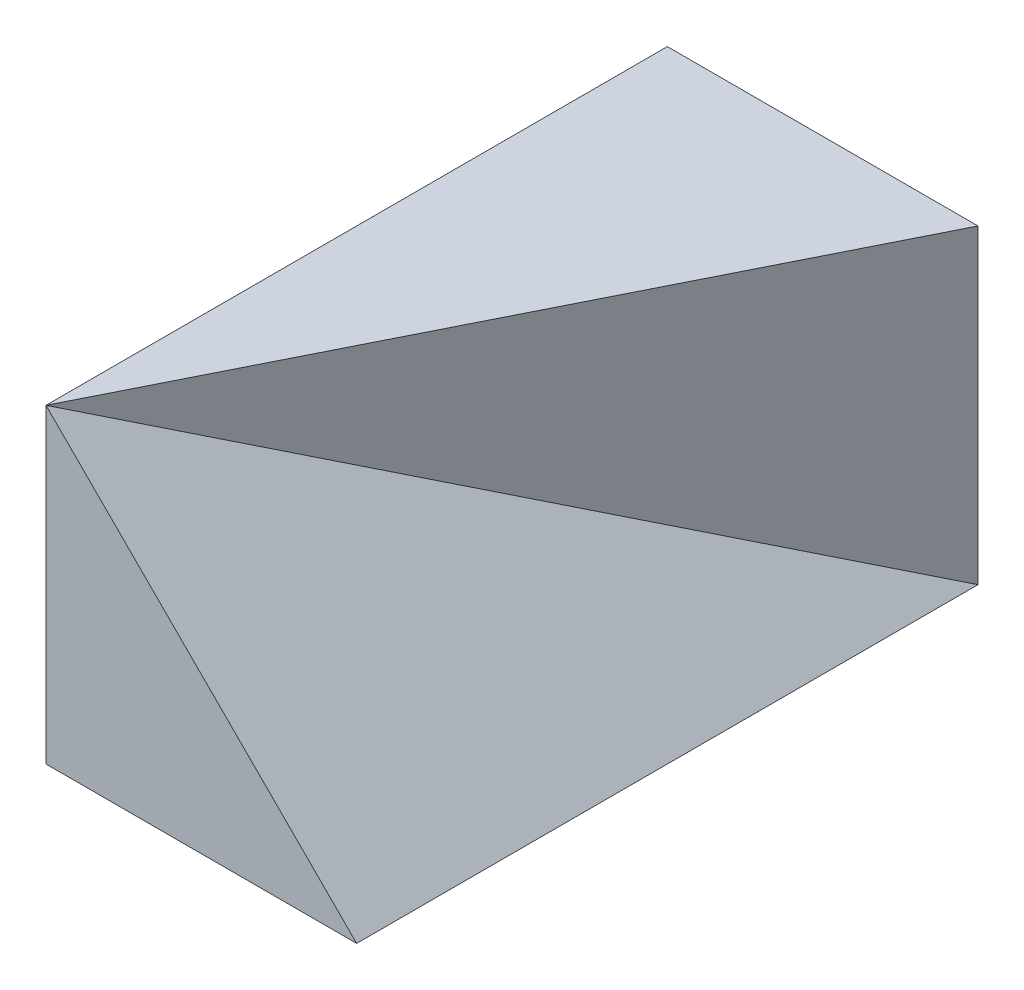
ISO-10303-21;
HEADER;
FILE_DESCRIPTION(('STEP AP214'),'2;1');
FILE_NAME('part.step','',(''),(''),'','','');
FILE_SCHEMA(('AUTOMOTIVE_DESIGN { 1 0 10303 214 1 1 1 1 }'));
ENDSEC;
DATA;
#1=APPLICATION_CONTEXT('core data for automotive mechanical design processes');
#2=APPLICATION_PROTOCOL_DEFINITION('international standard','automotive_design',2000,#1);
#3=PRODUCT_CONTEXT('',#1,'mechanical');
#4=PRODUCT('Part','Part','',(#3));
#5=PRODUCT_RELATED_PRODUCT_CATEGORY('part','',(#4));
#6=PRODUCT_DEFINITION_FORMATION('','',#4);
#7=PRODUCT_DEFINITION_CONTEXT('part definition',#1,'design');
#8=PRODUCT_DEFINITION('design','',#6,#7);
#9=PRODUCT_DEFINITION_SHAPE('','',#8);
#10=(LENGTH_UNIT() NAMED_UNIT(*) SI_UNIT(.MILLI.,.METRE.));
#11=(NAMED_UNIT(*) PLANE_ANGLE_UNIT() SI_UNIT($,.RADIAN.));
#12=(NAMED_UNIT(*) SI_UNIT($,.STERADIAN.) SOLID_ANGLE_UNIT());
#13=UNCERTAINTY_MEASURE_WITH_UNIT(LENGTH_MEASURE(1.E-05),#10,'distance_accuracy_value','');
#14=(GEOMETRIC_REPRESENTATION_CONTEXT(3) GLOBAL_UNCERTAINTY_ASSIGNED_CONTEXT((#13)) GLOBAL_UNIT_ASSIGNED_CONTEXT((#10,
#11,#12)) REPRESENTATION_CONTEXT('',''));
#15=CARTESIAN_POINT('',(0.,0.,0.));
#16=DIRECTION('',(0.,0.,1.));
#17=DIRECTION('',(1.,0.,0.));
#18=AXIS2_PLACEMENT_3D('',#15,#16,#17);
#19=CARTESIAN_POINT('',(-25.,25.,50.));
#20=DIRECTION('',(0.,-1.,0.));
#21=DIRECTION('',(0.,0.,-1.));
#22=AXIS2_PLACEMENT_3D('',#19,#20,#21);
#23=PLANE('',#22);
#24=DIRECTION('',(-0.447213595499958,0.,0.894427190999916));
#25=VECTOR('',#24,1.);
#26=CARTESIAN_POINT('',(-25.,25.,50.));
#27=LINE('',#26,#25);
#28=CARTESIAN_POINT('',(25.,25.,-50.));
#29=VERTEX_POINT('',#28);
#30=CARTESIAN_POINT('',(-25.,25.,50.));
#31=VERTEX_POINT('',#30);
#32=EDGE_CURVE('E139',#29,#31,#27,.T.);
#33=ORIENTED_EDGE('',*,*,#32,.F.);
#34=DIRECTION('',(-1.,0.,0.));
#35=VECTOR('',#34,1.);
#36=CARTESIAN_POINT('',(-25.,25.,-50.));
#37=LINE('',#36,#35);
#38=CARTESIAN_POINT('',(-25.,25.,-50.));
#39=VERTEX_POINT('',#38);
#40=EDGE_CURVE('E111',#29,#39,#37,.T.);
#41=ORIENTED_EDGE('',*,*,#40,.T.);
#42=DIRECTION('',(0.,0.,-1.));
#43=VECTOR('',#42,1.);
#44=CARTESIAN_POINT('',(-25.,25.,50.));
#45=LINE('',#44,#43);
#46=EDGE_CURVE('E12',#31,#39,#45,.T.);
#47=ORIENTED_EDGE('',*,*,#46,.F.);
#48=EDGE_LOOP('',(#33,#41,#47));
#49=FACE_BOUND('',#48,.T.);
#50=ADVANCED_FACE('F70',(#49),#23,.F.);
#51=CARTESIAN_POINT('',(-25.,-25.,50.));
#52=DIRECTION('',(1.,0.,0.));
#53=DIRECTION('',(0.,0.,-1.));
#54=AXIS2_PLACEMENT_3D('',#51,#52,#53);
#55=PLANE('',#54);
#56=DIRECTION('',(0.,-1.,0.));
#57=VECTOR('',#56,1.);
#58=CARTESIAN_POINT('',(-25.,-25.,-50.));
#59=LINE('',#58,#57);
#60=CARTESIAN_POINT('',(-25.,-25.,-50.));
#61=VERTEX_POINT('',#60);
#62=EDGE_CURVE('E101',#39,#61,#59,.T.);
#63=ORIENTED_EDGE('',*,*,#62,.T.);
#64=DIRECTION('',(0.,0.,-1.));
#65=VECTOR('',#64,1.);
#66=CARTESIAN_POINT('',(-25.,-25.,50.));
#67=LINE('',#66,#65);
#68=CARTESIAN_POINT('',(-25.,-25.,50.));
#69=VERTEX_POINT('',#68);
#70=EDGE_CURVE('E80',#69,#61,#67,.T.);
#71=ORIENTED_EDGE('',*,*,#70,.F.);
#72=DIRECTION('',(0.,-1.,0.));
#73=VECTOR('',#72,1.);
#74=CARTESIAN_POINT('',(-25.,-25.,50.));
#75=LINE('',#74,#73);
#76=EDGE_CURVE('E88',#31,#69,#75,.T.);
#77=ORIENTED_EDGE('',*,*,#76,.F.);
#78=ORIENTED_EDGE('',*,*,#46,.T.);
#79=EDGE_LOOP('',(#63,#71,#77,#78));
#80=FACE_BOUND('',#79,.T.);
#81=ADVANCED_FACE('F103',(#80),#55,.F.);
#82=CARTESIAN_POINT('',(-25.,-25.,50.));
#83=DIRECTION('',(0.,1.,0.));
#84=DIRECTION('',(0.,0.,1.));
#85=AXIS2_PLACEMENT_3D('',#82,#83,#84);
#86=PLANE('',#85);
#87=DIRECTION('',(1.,0.,0.));
#88=VECTOR('',#87,1.);
#89=CARTESIAN_POINT('',(-25.,-25.,-50.));
#90=LINE('',#89,#88);
#91=CARTESIAN_POINT('',(25.,-25.,-50.));
#92=VERTEX_POINT('',#91);
#93=EDGE_CURVE('E110',#61,#92,#90,.T.);
#94=ORIENTED_EDGE('',*,*,#93,.T.);
#95=DIRECTION('',(0.,0.,-1.));
#96=VECTOR('',#95,1.);
#97=CARTESIAN_POINT('',(25.,-25.,50.));
#98=LINE('',#97,#96);
#99=CARTESIAN_POINT('',(25.,-25.,50.));
#100=VERTEX_POINT('',#99);
#101=EDGE_CURVE('E120',#100,#92,#98,.T.);
#102=ORIENTED_EDGE('',*,*,#101,.F.);
#103=DIRECTION('',(1.,0.,0.));
#104=VECTOR('',#103,1.);
#105=CARTESIAN_POINT('',(-25.,-25.,50.));
#106=LINE('',#105,#104);
#107=EDGE_CURVE('E118',#69,#100,#106,.T.);
#108=ORIENTED_EDGE('',*,*,#107,.F.);
#109=ORIENTED_EDGE('',*,*,#70,.T.);
#110=EDGE_LOOP('',(#94,#102,#108,#109));
#111=FACE_BOUND('',#110,.T.);
#112=ADVANCED_FACE('F115',(#111),#86,.F.);
#113=CARTESIAN_POINT('',(0.,0.,50.));
#114=DIRECTION('',(0.,0.,-1.));
#115=DIRECTION('',(-1.,0.,0.));
#116=AXIS2_PLACEMENT_3D('',#113,#114,#115);
#117=PLANE('',#116);
#118=ORIENTED_EDGE('',*,*,#107,.T.);
#119=DIRECTION('',(-0.707106781186547,0.707106781186547,0.));
#120=VECTOR('',#119,1.);
#121=CARTESIAN_POINT('',(25.,-25.,50.));
#122=LINE('',#121,#120);
#123=EDGE_CURVE('E150',#100,#31,#122,.T.);
#124=ORIENTED_EDGE('',*,*,#123,.T.);
#125=ORIENTED_EDGE('',*,*,#76,.T.);
#126=EDGE_LOOP('',(#118,#124,#125));
#127=FACE_BOUND('',#126,.T.);
#128=ADVANCED_FACE('F147',(#127),#117,.F.);
#129=CARTESIAN_POINT('',(0.,0.,-50.));
#130=DIRECTION('',(0.,0.,-1.));
#131=DIRECTION('',(-1.,0.,0.));
#132=AXIS2_PLACEMENT_3D('',#129,#130,#131);
#133=PLANE('',#132);
#134=DIRECTION('',(0.,1.,0.));
#135=VECTOR('',#134,1.);
#136=CARTESIAN_POINT('',(25.,-25.,-50.));
#137=LINE('',#136,#135);
#138=EDGE_CURVE('E124',#92,#29,#137,.T.);
#139=ORIENTED_EDGE('',*,*,#138,.F.);
#140=ORIENTED_EDGE('',*,*,#93,.F.);
#141=ORIENTED_EDGE('',*,*,#62,.F.);
#142=ORIENTED_EDGE('',*,*,#40,.F.);
#143=EDGE_LOOP('',(#139,#140,#141,#142));
#144=FACE_BOUND('',#143,.T.);
#145=ADVANCED_FACE('F122',(#144),#133,.T.);
#146=CARTESIAN_POINT('',(-25.,25.,50.));
#147=DIRECTION('',(0.894427190999916,0.,0.447213595499958));
#148=DIRECTION('',(0.447213595499958,0.,-0.894427190999916));
#149=AXIS2_PLACEMENT_3D('',#146,#147,#148);
#150=PLANE('',#149);
#151=ORIENTED_EDGE('',*,*,#32,.T.);
#152=DIRECTION('',(0.408248290463863,-0.408248290463863,-0.816496580927726));
#153=VECTOR('',#152,1.);
#154=CARTESIAN_POINT('',(-25.,25.,50.));
#155=LINE('',#154,#153);
#156=EDGE_CURVE('E154',#31,#92,#155,.T.);
#157=ORIENTED_EDGE('',*,*,#156,.T.);
#158=ORIENTED_EDGE('',*,*,#138,.T.);
#159=EDGE_LOOP('',(#151,#157,#158));
#160=FACE_BOUND('',#159,.T.);
#161=ADVANCED_FACE('F173',(#160),#150,.T.);
#162=CARTESIAN_POINT('',(0.,0.,0.));
#163=DIRECTION('',(-0.707106781186548,-0.707106781186547,0.));
#164=DIRECTION('',(0.707106781186547,-0.707106781186548,0.));
#165=AXIS2_PLACEMENT_3D('',#162,#163,#164);
#166=PLANE('',#165);
#167=ORIENTED_EDGE('',*,*,#101,.T.);
#168=ORIENTED_EDGE('',*,*,#156,.F.);
#169=ORIENTED_EDGE('',*,*,#123,.F.);
#170=EDGE_LOOP('',(#167,#168,#169));
#171=FACE_BOUND('',#170,.T.);
#172=ADVANCED_FACE('F153',(#171),#166,.F.);
#173=CLOSED_SHELL('',(#50,#81,#112,#128,#145,#161,#172));
#174=MANIFOLD_SOLID_BREP('B2',#173);
#175=ADVANCED_BREP_SHAPE_REPRESENTATION('',(#18,#174),#14);
#176=SHAPE_DEFINITION_REPRESENTATION(#9,#175);
ENDSEC;
END-ISO-10303-21;
